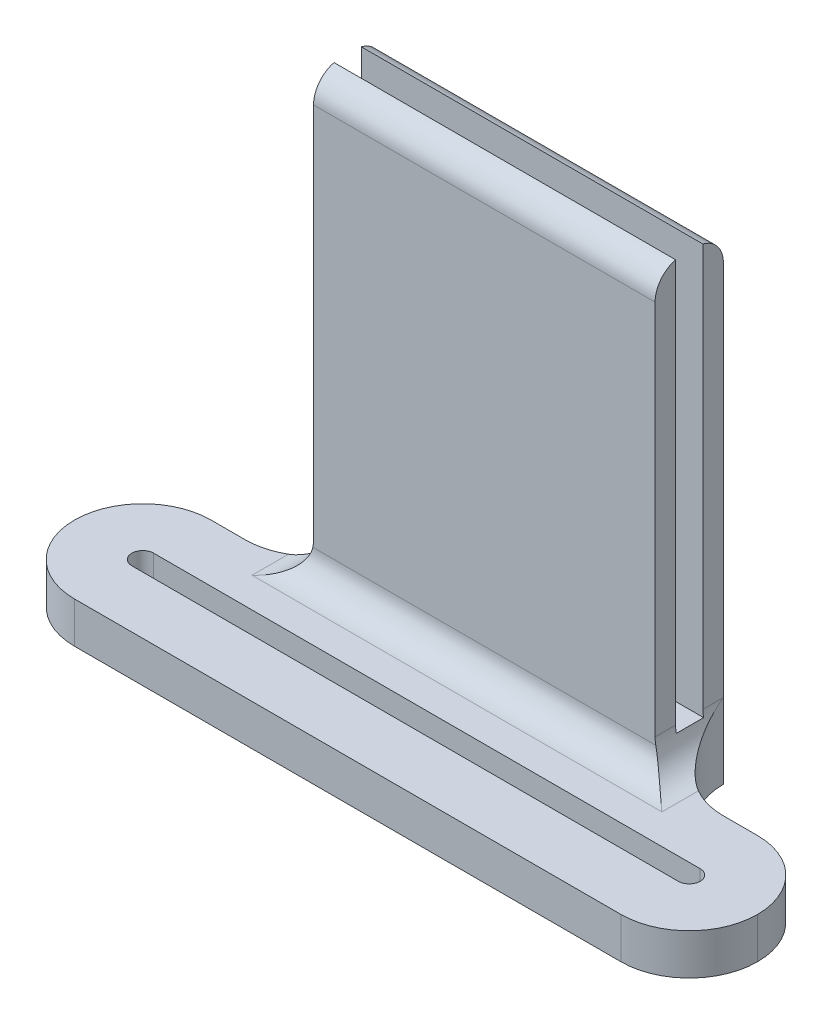
ISO-10303-21;
HEADER;
FILE_DESCRIPTION(('STEP AP214'),'2;1');
FILE_NAME('part.step','',(''),(''),'','','');
FILE_SCHEMA(('AUTOMOTIVE_DESIGN { 1 0 10303 214 1 1 1 1 }'));
ENDSEC;
DATA;
#1=APPLICATION_CONTEXT('core data for automotive mechanical design processes');
#2=APPLICATION_PROTOCOL_DEFINITION('international standard','automotive_design',2000,#1);
#3=PRODUCT_CONTEXT('',#1,'mechanical');
#4=PRODUCT('Part','Part','',(#3));
#5=PRODUCT_RELATED_PRODUCT_CATEGORY('part','',(#4));
#6=PRODUCT_DEFINITION_FORMATION('','',#4);
#7=PRODUCT_DEFINITION_CONTEXT('part definition',#1,'design');
#8=PRODUCT_DEFINITION('design','',#6,#7);
#9=PRODUCT_DEFINITION_SHAPE('','',#8);
#10=(LENGTH_UNIT() NAMED_UNIT(*) SI_UNIT(.MILLI.,.METRE.));
#11=(NAMED_UNIT(*) PLANE_ANGLE_UNIT() SI_UNIT($,.RADIAN.));
#12=(NAMED_UNIT(*) SI_UNIT($,.STERADIAN.) SOLID_ANGLE_UNIT());
#13=UNCERTAINTY_MEASURE_WITH_UNIT(LENGTH_MEASURE(1.E-05),#10,'distance_accuracy_value','');
#14=(GEOMETRIC_REPRESENTATION_CONTEXT(3) GLOBAL_UNCERTAINTY_ASSIGNED_CONTEXT((#13)) GLOBAL_UNIT_ASSIGNED_CONTEXT((#10,
#11,#12)) REPRESENTATION_CONTEXT('',''));
#15=CARTESIAN_POINT('',(0.,0.,0.));
#16=DIRECTION('',(0.,0.,1.));
#17=DIRECTION('',(1.,0.,0.));
#18=AXIS2_PLACEMENT_3D('',#15,#16,#17);
#19=CARTESIAN_POINT('',(25.,70.,5.));
#20=DIRECTION('',(-1.,0.,0.));
#21=DIRECTION('',(0.,0.,1.));
#22=AXIS2_PLACEMENT_3D('',#19,#20,#21);
#23=PLANE('',#22);
#24=DIRECTION('',(0.,1.,0.));
#25=VECTOR('',#24,1.);
#26=CARTESIAN_POINT('',(25.,10.,2.));
#27=LINE('',#26,#25);
#28=CARTESIAN_POINT('',(25.,11.,2.));
#29=VERTEX_POINT('',#28);
#30=CARTESIAN_POINT('',(25.,70.,2.));
#31=VERTEX_POINT('',#30);
#32=EDGE_CURVE('E287',#29,#31,#27,.T.);
#33=ORIENTED_EDGE('',*,*,#32,.T.);
#34=CARTESIAN_POINT('',(25.,66.1270166537926,0.999999999999999));
#35=DIRECTION('',(-1.,0.,0.));
#36=DIRECTION('',(0.,0.,1.));
#37=AXIS2_PLACEMENT_3D('',#34,#35,#36);
#38=CIRCLE('',#37,4.);
#39=CARTESIAN_POINT('',(25.,66.1270166537926,5.));
#40=VERTEX_POINT('',#39);
#41=EDGE_CURVE('E428',#31,#40,#38,.F.);
#42=ORIENTED_EDGE('',*,*,#41,.T.);
#43=DIRECTION('',(0.,-1.,0.));
#44=VECTOR('',#43,1.);
#45=CARTESIAN_POINT('',(25.,70.,5.));
#46=LINE('',#45,#44);
#47=CARTESIAN_POINT('',(25.,11.,5.));
#48=VERTEX_POINT('',#47);
#49=EDGE_CURVE('E301',#40,#48,#46,.T.);
#50=ORIENTED_EDGE('',*,*,#49,.T.);
#51=DIRECTION('',(0.,0.,-1.));
#52=VECTOR('',#51,1.);
#53=CARTESIAN_POINT('',(25.,11.,-5.));
#54=LINE('',#53,#52);
#55=EDGE_CURVE('E372',#48,#29,#54,.T.);
#56=ORIENTED_EDGE('',*,*,#55,.T.);
#57=EDGE_LOOP('',(#33,#42,#50,#56));
#58=FACE_BOUND('',#57,.T.);
#59=ADVANCED_FACE('F39',(#58),#23,.F.);
#60=CARTESIAN_POINT('',(-25.,70.,5.));
#61=DIRECTION('',(1.,0.,0.));
#62=DIRECTION('',(0.,0.,-1.));
#63=AXIS2_PLACEMENT_3D('',#60,#61,#62);
#64=PLANE('',#63);
#65=DIRECTION('',(0.,1.,0.));
#66=VECTOR('',#65,1.);
#67=CARTESIAN_POINT('',(-25.,10.,-2.));
#68=LINE('',#67,#66);
#69=CARTESIAN_POINT('',(-25.,11.,-2.));
#70=VERTEX_POINT('',#69);
#71=CARTESIAN_POINT('',(-25.,70.,-2.));
#72=VERTEX_POINT('',#71);
#73=EDGE_CURVE('E294',#70,#72,#68,.T.);
#74=ORIENTED_EDGE('',*,*,#73,.T.);
#75=CARTESIAN_POINT('',(-25.,66.1270166537926,-1.));
#76=DIRECTION('',(1.,0.,0.));
#77=DIRECTION('',(0.,0.,-1.));
#78=AXIS2_PLACEMENT_3D('',#75,#76,#77);
#79=CIRCLE('',#78,4.);
#80=CARTESIAN_POINT('',(-25.,66.1270166537926,-5.));
#81=VERTEX_POINT('',#80);
#82=EDGE_CURVE('E422',#72,#81,#79,.F.);
#83=ORIENTED_EDGE('',*,*,#82,.T.);
#84=DIRECTION('',(0.,-1.,0.));
#85=VECTOR('',#84,1.);
#86=CARTESIAN_POINT('',(-25.,70.,-5.));
#87=LINE('',#86,#85);
#88=CARTESIAN_POINT('',(-25.,11.,-5.));
#89=VERTEX_POINT('',#88);
#90=EDGE_CURVE('E307',#81,#89,#87,.T.);
#91=ORIENTED_EDGE('',*,*,#90,.T.);
#92=DIRECTION('',(0.,0.,1.));
#93=VECTOR('',#92,1.);
#94=CARTESIAN_POINT('',(-25.,11.,5.));
#95=LINE('',#94,#93);
#96=EDGE_CURVE('E362',#89,#70,#95,.T.);
#97=ORIENTED_EDGE('',*,*,#96,.T.);
#98=EDGE_LOOP('',(#74,#83,#91,#97));
#99=FACE_BOUND('',#98,.T.);
#100=ADVANCED_FACE('F466',(#99),#64,.F.);
#101=CARTESIAN_POINT('',(-25.,70.,5.));
#102=DIRECTION('',(0.,0.,-1.));
#103=DIRECTION('',(-1.,0.,0.));
#104=AXIS2_PLACEMENT_3D('',#101,#102,#103);
#105=PLANE('',#104);
#106=CARTESIAN_POINT('',(-30.,11.,5.));
#107=DIRECTION('',(0.,0.,-1.));
#108=DIRECTION('',(-1.,0.,0.));
#109=AXIS2_PLACEMENT_3D('',#106,#107,#108);
#110=CIRCLE('',#109,5.);
#111=CARTESIAN_POINT('',(-25.,11.,5.));
#112=VERTEX_POINT('',#111);
#113=CARTESIAN_POINT('',(-25.1010205144336,10.,5.));
#114=VERTEX_POINT('',#113);
#115=EDGE_CURVE('E383',#112,#114,#110,.T.);
#116=ORIENTED_EDGE('',*,*,#115,.T.);
#117=DIRECTION('',(-1.,0.,0.));
#118=VECTOR('',#117,1.);
#119=CARTESIAN_POINT('',(30.,10.,5.));
#120=LINE('',#119,#118);
#121=CARTESIAN_POINT('',(25.1010205144336,10.,5.));
#122=VERTEX_POINT('',#121);
#123=EDGE_CURVE('E60',#114,#122,#120,.F.);
#124=ORIENTED_EDGE('',*,*,#123,.T.);
#125=CARTESIAN_POINT('',(30.,11.,5.));
#126=DIRECTION('',(0.,0.,-1.));
#127=DIRECTION('',(-1.,0.,0.));
#128=AXIS2_PLACEMENT_3D('',#125,#126,#127);
#129=CIRCLE('',#128,5.);
#130=EDGE_CURVE('E430',#122,#48,#129,.T.);
#131=ORIENTED_EDGE('',*,*,#130,.T.);
#132=ORIENTED_EDGE('',*,*,#49,.F.);
#133=DIRECTION('',(-1.,0.,0.));
#134=VECTOR('',#133,1.);
#135=CARTESIAN_POINT('',(-25.,66.1270166537926,5.));
#136=LINE('',#135,#134);
#137=CARTESIAN_POINT('',(-25.,66.1270166537926,5.));
#138=VERTEX_POINT('',#137);
#139=EDGE_CURVE('E426',#40,#138,#136,.T.);
#140=ORIENTED_EDGE('',*,*,#139,.T.);
#141=DIRECTION('',(0.,-1.,0.));
#142=VECTOR('',#141,1.);
#143=CARTESIAN_POINT('',(-25.,70.,5.));
#144=LINE('',#143,#142);
#145=EDGE_CURVE('E304',#138,#112,#144,.T.);
#146=ORIENTED_EDGE('',*,*,#145,.T.);
#147=EDGE_LOOP('',(#116,#124,#131,#132,#140,#146));
#148=FACE_BOUND('',#147,.T.);
#149=ADVANCED_FACE('F494',(#148),#105,.F.);
#150=DIRECTION('',(0.,-1.,0.));
#151=VECTOR('',#150,1.);
#152=CARTESIAN_POINT('',(25.,70.,-5.));
#153=LINE('',#152,#151);
#154=CARTESIAN_POINT('',(25.,66.1270166537926,-5.));
#155=VERTEX_POINT('',#154);
#156=CARTESIAN_POINT('',(25.,11.,-5.));
#157=VERTEX_POINT('',#156);
#158=EDGE_CURVE('E310',#155,#157,#153,.T.);
#159=ORIENTED_EDGE('',*,*,#158,.F.);
#160=CARTESIAN_POINT('',(25.,66.1270166537926,-1.));
#161=DIRECTION('',(-1.,0.,0.));
#162=DIRECTION('',(0.,0.,1.));
#163=AXIS2_PLACEMENT_3D('',#160,#161,#162);
#164=CIRCLE('',#163,4.);
#165=CARTESIAN_POINT('',(25.,70.,-2.));
#166=VERTEX_POINT('',#165);
#167=EDGE_CURVE('E418',#155,#166,#164,.F.);
#168=ORIENTED_EDGE('',*,*,#167,.T.);
#169=DIRECTION('',(0.,1.,0.));
#170=VECTOR('',#169,1.);
#171=CARTESIAN_POINT('',(25.,10.,-2.));
#172=LINE('',#171,#170);
#173=CARTESIAN_POINT('',(25.,11.,-2.));
#174=VERTEX_POINT('',#173);
#175=EDGE_CURVE('E282',#174,#166,#172,.T.);
#176=ORIENTED_EDGE('',*,*,#175,.F.);
#177=DIRECTION('',(0.,0.,-1.));
#178=VECTOR('',#177,1.);
#179=CARTESIAN_POINT('',(25.,11.,-5.));
#180=LINE('',#179,#178);
#181=EDGE_CURVE('E369',#174,#157,#180,.T.);
#182=ORIENTED_EDGE('',*,*,#181,.T.);
#183=EDGE_LOOP('',(#159,#168,#176,#182));
#184=FACE_BOUND('',#183,.T.);
#185=ADVANCED_FACE('F458',(#184),#23,.F.);
#186=CARTESIAN_POINT('',(-25.,70.,-5.));
#187=DIRECTION('',(0.,0.,1.));
#188=DIRECTION('',(1.,0.,0.));
#189=AXIS2_PLACEMENT_3D('',#186,#187,#188);
#190=PLANE('',#189);
#191=ORIENTED_EDGE('',*,*,#90,.F.);
#192=DIRECTION('',(1.,0.,0.));
#193=VECTOR('',#192,1.);
#194=CARTESIAN_POINT('',(-25.,66.1270166537926,-5.));
#195=LINE('',#194,#193);
#196=EDGE_CURVE('E420',#81,#155,#195,.T.);
#197=ORIENTED_EDGE('',*,*,#196,.T.);
#198=ORIENTED_EDGE('',*,*,#158,.T.);
#199=CARTESIAN_POINT('',(25.,0.,-5.));
#200=VERTEX_POINT('',#199);
#201=EDGE_CURVE('E309',#157,#200,#153,.T.);
#202=ORIENTED_EDGE('',*,*,#201,.T.);
#203=DIRECTION('',(-1.,0.,0.));
#204=VECTOR('',#203,1.);
#205=CARTESIAN_POINT('',(-25.,0.,-5.));
#206=LINE('',#205,#204);
#207=CARTESIAN_POINT('',(-25.,0.,-5.));
#208=VERTEX_POINT('',#207);
#209=EDGE_CURVE('E290',#200,#208,#206,.T.);
#210=ORIENTED_EDGE('',*,*,#209,.T.);
#211=EDGE_CURVE('E306',#89,#208,#87,.T.);
#212=ORIENTED_EDGE('',*,*,#211,.F.);
#213=EDGE_LOOP('',(#191,#197,#198,#202,#210,#212));
#214=FACE_BOUND('',#213,.T.);
#215=ADVANCED_FACE('F500',(#214),#190,.F.);
#216=ORIENTED_EDGE('',*,*,#145,.F.);
#217=CARTESIAN_POINT('',(-25.,66.1270166537926,0.999999999999999));
#218=DIRECTION('',(1.,0.,0.));
#219=DIRECTION('',(0.,0.,-1.));
#220=AXIS2_PLACEMENT_3D('',#217,#218,#219);
#221=CIRCLE('',#220,4.);
#222=CARTESIAN_POINT('',(-25.,70.,2.));
#223=VERTEX_POINT('',#222);
#224=EDGE_CURVE('E424',#138,#223,#221,.F.);
#225=ORIENTED_EDGE('',*,*,#224,.T.);
#226=DIRECTION('',(0.,1.,0.));
#227=VECTOR('',#226,1.);
#228=CARTESIAN_POINT('',(-25.,10.,2.));
#229=LINE('',#228,#227);
#230=CARTESIAN_POINT('',(-25.,11.,2.));
#231=VERTEX_POINT('',#230);
#232=EDGE_CURVE('E291',#231,#223,#229,.T.);
#233=ORIENTED_EDGE('',*,*,#232,.F.);
#234=DIRECTION('',(0.,0.,1.));
#235=VECTOR('',#234,1.);
#236=CARTESIAN_POINT('',(-25.,11.,5.));
#237=LINE('',#236,#235);
#238=EDGE_CURVE('E359',#231,#112,#237,.T.);
#239=ORIENTED_EDGE('',*,*,#238,.T.);
#240=EDGE_LOOP('',(#216,#225,#233,#239));
#241=FACE_BOUND('',#240,.T.);
#242=ADVANCED_FACE('F496',(#241),#64,.F.);
#243=CARTESIAN_POINT('',(0.,0.,0.));
#244=DIRECTION('',(0.,-1.,0.));
#245=DIRECTION('',(0.,0.,-1.));
#246=AXIS2_PLACEMENT_3D('',#243,#244,#245);
#247=PLANE('',#246);
#248=CARTESIAN_POINT('',(-40.,0.,15.));
#249=DIRECTION('',(0.,1.,0.));
#250=DIRECTION('',(0.,0.,1.));
#251=AXIS2_PLACEMENT_3D('',#248,#249,#250);
#252=CIRCLE('',#251,1.6);
#253=CARTESIAN_POINT('',(-40.,0.,13.4));
#254=VERTEX_POINT('',#253);
#255=CARTESIAN_POINT('',(-40.,0.,16.6));
#256=VERTEX_POINT('',#255);
#257=EDGE_CURVE('E222',#254,#256,#252,.T.);
#258=ORIENTED_EDGE('',*,*,#257,.T.);
#259=DIRECTION('',(1.,0.,0.));
#260=VECTOR('',#259,1.);
#261=CARTESIAN_POINT('',(-40.,0.,16.6));
#262=LINE('',#261,#260);
#263=CARTESIAN_POINT('',(40.,0.,16.6));
#264=VERTEX_POINT('',#263);
#265=EDGE_CURVE('E234',#256,#264,#262,.T.);
#266=ORIENTED_EDGE('',*,*,#265,.T.);
#267=CARTESIAN_POINT('',(40.,0.,15.));
#268=DIRECTION('',(0.,1.,0.));
#269=DIRECTION('',(0.,0.,1.));
#270=AXIS2_PLACEMENT_3D('',#267,#268,#269);
#271=CIRCLE('',#270,1.6);
#272=CARTESIAN_POINT('',(40.,0.,13.4));
#273=VERTEX_POINT('',#272);
#274=EDGE_CURVE('E238',#264,#273,#271,.T.);
#275=ORIENTED_EDGE('',*,*,#274,.T.);
#276=DIRECTION('',(-1.,0.,0.));
#277=VECTOR('',#276,1.);
#278=CARTESIAN_POINT('',(-40.,0.,13.4));
#279=LINE('',#278,#277);
#280=EDGE_CURVE('E230',#273,#254,#279,.T.);
#281=ORIENTED_EDGE('',*,*,#280,.T.);
#282=EDGE_LOOP('',(#258,#266,#275,#281));
#283=FACE_BOUND('',#282,.T.);
#284=DIRECTION('',(1.,0.,0.));
#285=VECTOR('',#284,1.);
#286=CARTESIAN_POINT('',(-50.,0.,25.));
#287=LINE('',#286,#285);
#288=CARTESIAN_POINT('',(-40.,0.,25.));
#289=VERTEX_POINT('',#288);
#290=CARTESIAN_POINT('',(40.,0.,25.));
#291=VERTEX_POINT('',#290);
#292=EDGE_CURVE('E262',#289,#291,#287,.T.);
#293=ORIENTED_EDGE('',*,*,#292,.F.);
#294=CARTESIAN_POINT('',(-40.,0.,15.));
#295=DIRECTION('',(0.,-1.,0.));
#296=DIRECTION('',(0.,0.,-1.));
#297=AXIS2_PLACEMENT_3D('',#294,#295,#296);
#298=CIRCLE('',#297,10.);
#299=CARTESIAN_POINT('',(-50.,0.,15.));
#300=VERTEX_POINT('',#299);
#301=EDGE_CURVE('E332',#289,#300,#298,.T.);
#302=ORIENTED_EDGE('',*,*,#301,.T.);
#303=CARTESIAN_POINT('',(-40.,0.,15.));
#304=DIRECTION('',(0.,-1.,0.));
#305=DIRECTION('',(0.,0.,-1.));
#306=AXIS2_PLACEMENT_3D('',#303,#304,#305);
#307=CIRCLE('',#306,10.);
#308=CARTESIAN_POINT('',(-40.,0.,5.));
#309=VERTEX_POINT('',#308);
#310=EDGE_CURVE('E330',#300,#309,#307,.T.);
#311=ORIENTED_EDGE('',*,*,#310,.T.);
#312=DIRECTION('',(1.,0.,0.));
#313=VECTOR('',#312,1.);
#314=CARTESIAN_POINT('',(-50.,0.,5.));
#315=LINE('',#314,#313);
#316=CARTESIAN_POINT('',(-35.,0.,5.));
#317=VERTEX_POINT('',#316);
#318=EDGE_CURVE('E270',#309,#317,#315,.T.);
#319=ORIENTED_EDGE('',*,*,#318,.T.);
#320=CARTESIAN_POINT('',(-35.,0.,-5.));
#321=DIRECTION('',(0.,-1.,0.));
#322=DIRECTION('',(0.,0.,-1.));
#323=AXIS2_PLACEMENT_3D('',#320,#321,#322);
#324=CIRCLE('',#323,10.);
#325=EDGE_CURVE('E350',#317,#208,#324,.F.);
#326=ORIENTED_EDGE('',*,*,#325,.T.);
#327=ORIENTED_EDGE('',*,*,#209,.F.);
#328=CARTESIAN_POINT('',(35.,0.,-5.));
#329=DIRECTION('',(0.,-1.,0.));
#330=DIRECTION('',(0.,0.,-1.));
#331=AXIS2_PLACEMENT_3D('',#328,#329,#330);
#332=CIRCLE('',#331,10.);
#333=CARTESIAN_POINT('',(35.,0.,5.));
#334=VERTEX_POINT('',#333);
#335=EDGE_CURVE('E354',#200,#334,#332,.F.);
#336=ORIENTED_EDGE('',*,*,#335,.T.);
#337=CARTESIAN_POINT('',(40.,0.,5.));
#338=VERTEX_POINT('',#337);
#339=EDGE_CURVE('E274',#334,#338,#315,.T.);
#340=ORIENTED_EDGE('',*,*,#339,.T.);
#341=CARTESIAN_POINT('',(40.,0.,15.));
#342=DIRECTION('',(0.,-1.,0.));
#343=DIRECTION('',(0.,0.,-1.));
#344=AXIS2_PLACEMENT_3D('',#341,#342,#343);
#345=CIRCLE('',#344,10.);
#346=CARTESIAN_POINT('',(50.,0.,15.));
#347=VERTEX_POINT('',#346);
#348=EDGE_CURVE('E326',#338,#347,#345,.T.);
#349=ORIENTED_EDGE('',*,*,#348,.T.);
#350=CARTESIAN_POINT('',(40.,0.,15.));
#351=DIRECTION('',(0.,-1.,0.));
#352=DIRECTION('',(0.,0.,-1.));
#353=AXIS2_PLACEMENT_3D('',#350,#351,#352);
#354=CIRCLE('',#353,10.);
#355=EDGE_CURVE('E328',#347,#291,#354,.T.);
#356=ORIENTED_EDGE('',*,*,#355,.T.);
#357=EDGE_LOOP('',(#293,#302,#311,#319,#326,#327,#336,#340,#349,#356));
#358=FACE_BOUND('',#357,.T.);
#359=ADVANCED_FACE('F240',(#283,#358),#247,.T.);
#360=CARTESIAN_POINT('',(-25.,10.,2.));
#361=DIRECTION('',(0.,0.,1.));
#362=DIRECTION('',(1.,0.,0.));
#363=AXIS2_PLACEMENT_3D('',#360,#361,#362);
#364=PLANE('',#363);
#365=DIRECTION('',(1.,0.,0.));
#366=VECTOR('',#365,1.);
#367=CARTESIAN_POINT('',(-25.,70.,2.));
#368=LINE('',#367,#366);
#369=EDGE_CURVE('E280',#223,#31,#368,.T.);
#370=ORIENTED_EDGE('',*,*,#369,.T.);
#371=ORIENTED_EDGE('',*,*,#32,.F.);
#372=CARTESIAN_POINT('',(30.,11.,2.));
#373=DIRECTION('',(0.,0.,1.));
#374=DIRECTION('',(1.,0.,0.));
#375=AXIS2_PLACEMENT_3D('',#372,#373,#374);
#376=CIRCLE('',#375,5.);
#377=CARTESIAN_POINT('',(25.1010205144336,10.,2.));
#378=VERTEX_POINT('',#377);
#379=EDGE_CURVE('E394',#29,#378,#376,.T.);
#380=ORIENTED_EDGE('',*,*,#379,.T.);
#381=DIRECTION('',(1.,0.,0.));
#382=VECTOR('',#381,1.);
#383=CARTESIAN_POINT('',(-25.,10.,2.));
#384=LINE('',#383,#382);
#385=CARTESIAN_POINT('',(-25.1010205144336,10.,2.));
#386=VERTEX_POINT('',#385);
#387=EDGE_CURVE('E279',#386,#378,#384,.T.);
#388=ORIENTED_EDGE('',*,*,#387,.F.);
#389=CARTESIAN_POINT('',(-30.,11.,2.));
#390=DIRECTION('',(0.,0.,1.));
#391=DIRECTION('',(1.,0.,0.));
#392=AXIS2_PLACEMENT_3D('',#389,#390,#391);
#393=CIRCLE('',#392,5.);
#394=EDGE_CURVE('E381',#386,#231,#393,.T.);
#395=ORIENTED_EDGE('',*,*,#394,.T.);
#396=ORIENTED_EDGE('',*,*,#232,.T.);
#397=EDGE_LOOP('',(#370,#371,#380,#388,#395,#396));
#398=FACE_BOUND('',#397,.T.);
#399=ADVANCED_FACE('F447',(#398),#364,.F.);
#400=CARTESIAN_POINT('',(-25.,10.,-2.));
#401=DIRECTION('',(0.,0.,-1.));
#402=DIRECTION('',(-1.,0.,0.));
#403=AXIS2_PLACEMENT_3D('',#400,#401,#402);
#404=PLANE('',#403);
#405=DIRECTION('',(-1.,0.,0.));
#406=VECTOR('',#405,1.);
#407=CARTESIAN_POINT('',(-25.,70.,-2.));
#408=LINE('',#407,#406);
#409=EDGE_CURVE('E269',#166,#72,#408,.T.);
#410=ORIENTED_EDGE('',*,*,#409,.T.);
#411=ORIENTED_EDGE('',*,*,#73,.F.);
#412=CARTESIAN_POINT('',(-30.,11.,-2.));
#413=DIRECTION('',(0.,0.,-1.));
#414=DIRECTION('',(-1.,0.,0.));
#415=AXIS2_PLACEMENT_3D('',#412,#413,#414);
#416=CIRCLE('',#415,5.);
#417=CARTESIAN_POINT('',(-25.1010205144336,10.,-2.));
#418=VERTEX_POINT('',#417);
#419=EDGE_CURVE('E375',#70,#418,#416,.T.);
#420=ORIENTED_EDGE('',*,*,#419,.T.);
#421=DIRECTION('',(-1.,0.,0.));
#422=VECTOR('',#421,1.);
#423=CARTESIAN_POINT('',(-25.,10.,-2.));
#424=LINE('',#423,#422);
#425=CARTESIAN_POINT('',(25.1010205144336,10.,-2.));
#426=VERTEX_POINT('',#425);
#427=EDGE_CURVE('E277',#426,#418,#424,.T.);
#428=ORIENTED_EDGE('',*,*,#427,.F.);
#429=CARTESIAN_POINT('',(30.,11.,-2.));
#430=DIRECTION('',(0.,0.,-1.));
#431=DIRECTION('',(-1.,0.,0.));
#432=AXIS2_PLACEMENT_3D('',#429,#430,#431);
#433=CIRCLE('',#432,5.);
#434=EDGE_CURVE('E438',#426,#174,#433,.T.);
#435=ORIENTED_EDGE('',*,*,#434,.T.);
#436=ORIENTED_EDGE('',*,*,#175,.T.);
#437=EDGE_LOOP('',(#410,#411,#420,#428,#435,#436));
#438=FACE_BOUND('',#437,.T.);
#439=ADVANCED_FACE('F454',(#438),#404,.F.);
#440=CARTESIAN_POINT('',(0.,10.,0.));
#441=DIRECTION('',(0.,-1.,0.));
#442=DIRECTION('',(0.,0.,-1.));
#443=AXIS2_PLACEMENT_3D('',#440,#441,#442);
#444=PLANE('',#443);
#445=ORIENTED_EDGE('',*,*,#387,.T.);
#446=DIRECTION('',(0.,0.,1.));
#447=VECTOR('',#446,1.);
#448=CARTESIAN_POINT('',(25.1010205144336,10.,2.));
#449=LINE('',#448,#447);
#450=EDGE_CURVE('E439',#378,#426,#449,.F.);
#451=ORIENTED_EDGE('',*,*,#450,.T.);
#452=ORIENTED_EDGE('',*,*,#427,.T.);
#453=DIRECTION('',(0.,0.,-1.));
#454=VECTOR('',#453,1.);
#455=CARTESIAN_POINT('',(-25.1010205144336,10.,-2.));
#456=LINE('',#455,#454);
#457=EDGE_CURVE('E378',#418,#386,#456,.F.);
#458=ORIENTED_EDGE('',*,*,#457,.T.);
#459=EDGE_LOOP('',(#445,#451,#452,#458));
#460=FACE_BOUND('',#459,.T.);
#461=ADVANCED_FACE('F473',(#460),#444,.F.);
#462=CARTESIAN_POINT('',(0.,0.,5.));
#463=DIRECTION('',(0.,0.,-1.));
#464=DIRECTION('',(-1.,0.,0.));
#465=AXIS2_PLACEMENT_3D('',#462,#463,#464);
#466=PLANE('',#465);
#467=ORIENTED_EDGE('',*,*,#339,.F.);
#468=DIRECTION('',(0.,-1.,0.));
#469=VECTOR('',#468,1.);
#470=CARTESIAN_POINT('',(35.,0.,5.));
#471=LINE('',#470,#469);
#472=CARTESIAN_POINT('',(35.,6.,5.));
#473=VERTEX_POINT('',#472);
#474=EDGE_CURVE('E348',#334,#473,#471,.F.);
#475=ORIENTED_EDGE('',*,*,#474,.T.);
#476=DIRECTION('',(-1.,0.,0.));
#477=VECTOR('',#476,1.);
#478=CARTESIAN_POINT('',(-50.,6.,5.));
#479=LINE('',#478,#477);
#480=CARTESIAN_POINT('',(40.,6.,5.));
#481=VERTEX_POINT('',#480);
#482=EDGE_CURVE('E266',#481,#473,#479,.T.);
#483=ORIENTED_EDGE('',*,*,#482,.F.);
#484=DIRECTION('',(0.,1.,0.));
#485=VECTOR('',#484,1.);
#486=CARTESIAN_POINT('',(40.,0.,5.));
#487=LINE('',#486,#485);
#488=EDGE_CURVE('E337',#481,#338,#487,.F.);
#489=ORIENTED_EDGE('',*,*,#488,.T.);
#490=EDGE_LOOP('',(#467,#475,#483,#489));
#491=FACE_BOUND('',#490,.T.);
#492=ADVANCED_FACE('F475',(#491),#466,.T.);
#493=CARTESIAN_POINT('',(-50.,6.,25.));
#494=DIRECTION('',(0.,-1.,0.));
#495=DIRECTION('',(0.,0.,-1.));
#496=AXIS2_PLACEMENT_3D('',#493,#494,#495);
#497=PLANE('',#496);
#498=DIRECTION('',(1.,0.,0.));
#499=VECTOR('',#498,1.);
#500=CARTESIAN_POINT('',(-40.,6.,16.6));
#501=LINE('',#500,#499);
#502=CARTESIAN_POINT('',(-40.,6.,16.6));
#503=VERTEX_POINT('',#502);
#504=CARTESIAN_POINT('',(40.,6.,16.6));
#505=VERTEX_POINT('',#504);
#506=EDGE_CURVE('E252',#503,#505,#501,.T.);
#507=ORIENTED_EDGE('',*,*,#506,.F.);
#508=CARTESIAN_POINT('',(-40.,6.,15.));
#509=DIRECTION('',(0.,1.,0.));
#510=DIRECTION('',(0.,0.,1.));
#511=AXIS2_PLACEMENT_3D('',#508,#509,#510);
#512=CIRCLE('',#511,1.6);
#513=CARTESIAN_POINT('',(-40.,6.,13.4));
#514=VERTEX_POINT('',#513);
#515=EDGE_CURVE('E225',#514,#503,#512,.T.);
#516=ORIENTED_EDGE('',*,*,#515,.F.);
#517=DIRECTION('',(-1.,0.,0.));
#518=VECTOR('',#517,1.);
#519=CARTESIAN_POINT('',(-40.,6.,13.4));
#520=LINE('',#519,#518);
#521=CARTESIAN_POINT('',(40.,6.,13.4));
#522=VERTEX_POINT('',#521);
#523=EDGE_CURVE('E243',#522,#514,#520,.T.);
#524=ORIENTED_EDGE('',*,*,#523,.F.);
#525=CARTESIAN_POINT('',(40.,6.,15.));
#526=DIRECTION('',(0.,1.,0.));
#527=DIRECTION('',(0.,0.,1.));
#528=AXIS2_PLACEMENT_3D('',#525,#526,#527);
#529=CIRCLE('',#528,1.6);
#530=EDGE_CURVE('E246',#505,#522,#529,.T.);
#531=ORIENTED_EDGE('',*,*,#530,.F.);
#532=EDGE_LOOP('',(#507,#516,#524,#531));
#533=FACE_BOUND('',#532,.T.);
#534=DIRECTION('',(-1.,0.,0.));
#535=VECTOR('',#534,1.);
#536=CARTESIAN_POINT('',(-30.,6.,9.));
#537=LINE('',#536,#535);
#538=CARTESIAN_POINT('',(30.,6.,9.));
#539=VERTEX_POINT('',#538);
#540=CARTESIAN_POINT('',(-30.,6.,9.));
#541=VERTEX_POINT('',#540);
#542=EDGE_CURVE('E415',#539,#541,#537,.T.);
#543=ORIENTED_EDGE('',*,*,#542,.T.);
#544=DIRECTION('',(0.,0.,1.));
#545=VECTOR('',#544,1.);
#546=CARTESIAN_POINT('',(-30.,6.,-5.));
#547=LINE('',#546,#545);
#548=CARTESIAN_POINT('',(-30.,6.,3.66025403784439));
#549=VERTEX_POINT('',#548);
#550=EDGE_CURVE('E367',#541,#549,#547,.F.);
#551=ORIENTED_EDGE('',*,*,#550,.T.);
#552=CARTESIAN_POINT('',(-35.,6.,-5.));
#553=DIRECTION('',(0.,-1.,0.));
#554=DIRECTION('',(0.,0.,-1.));
#555=AXIS2_PLACEMENT_3D('',#552,#553,#554);
#556=CIRCLE('',#555,10.);
#557=CARTESIAN_POINT('',(-35.,6.,5.));
#558=VERTEX_POINT('',#557);
#559=EDGE_CURVE('E352',#549,#558,#556,.T.);
#560=ORIENTED_EDGE('',*,*,#559,.T.);
#561=CARTESIAN_POINT('',(-40.,6.,5.));
#562=VERTEX_POINT('',#561);
#563=EDGE_CURVE('E273',#558,#562,#479,.T.);
#564=ORIENTED_EDGE('',*,*,#563,.T.);
#565=CARTESIAN_POINT('',(-40.,6.,15.));
#566=DIRECTION('',(0.,-1.,0.));
#567=DIRECTION('',(0.,0.,-1.));
#568=AXIS2_PLACEMENT_3D('',#565,#566,#567);
#569=CIRCLE('',#568,10.);
#570=CARTESIAN_POINT('',(-50.,6.,15.));
#571=VERTEX_POINT('',#570);
#572=EDGE_CURVE('E322',#562,#571,#569,.F.);
#573=ORIENTED_EDGE('',*,*,#572,.T.);
#574=CARTESIAN_POINT('',(-40.,6.,15.));
#575=DIRECTION('',(0.,-1.,0.));
#576=DIRECTION('',(0.,0.,-1.));
#577=AXIS2_PLACEMENT_3D('',#574,#575,#576);
#578=CIRCLE('',#577,10.);
#579=CARTESIAN_POINT('',(-40.,6.,25.));
#580=VERTEX_POINT('',#579);
#581=EDGE_CURVE('E324',#571,#580,#578,.F.);
#582=ORIENTED_EDGE('',*,*,#581,.T.);
#583=DIRECTION('',(-1.,0.,0.));
#584=VECTOR('',#583,1.);
#585=CARTESIAN_POINT('',(-50.,6.,25.));
#586=LINE('',#585,#584);
#587=CARTESIAN_POINT('',(40.,6.,25.));
#588=VERTEX_POINT('',#587);
#589=EDGE_CURVE('E265',#588,#580,#586,.T.);
#590=ORIENTED_EDGE('',*,*,#589,.F.);
#591=CARTESIAN_POINT('',(40.,6.,15.));
#592=DIRECTION('',(0.,-1.,0.));
#593=DIRECTION('',(0.,0.,-1.));
#594=AXIS2_PLACEMENT_3D('',#591,#592,#593);
#595=CIRCLE('',#594,10.);
#596=CARTESIAN_POINT('',(50.,6.,15.));
#597=VERTEX_POINT('',#596);
#598=EDGE_CURVE('E320',#588,#597,#595,.F.);
#599=ORIENTED_EDGE('',*,*,#598,.T.);
#600=CARTESIAN_POINT('',(40.,6.,15.));
#601=DIRECTION('',(0.,-1.,0.));
#602=DIRECTION('',(0.,0.,-1.));
#603=AXIS2_PLACEMENT_3D('',#600,#601,#602);
#604=CIRCLE('',#603,10.);
#605=EDGE_CURVE('E318',#597,#481,#604,.F.);
#606=ORIENTED_EDGE('',*,*,#605,.T.);
#607=ORIENTED_EDGE('',*,*,#482,.T.);
#608=CARTESIAN_POINT('',(35.,6.00000000000001,-5.));
#609=DIRECTION('',(0.,-1.,0.));
#610=DIRECTION('',(0.,0.,-1.));
#611=AXIS2_PLACEMENT_3D('',#608,#609,#610);
#612=CIRCLE('',#611,10.);
#613=CARTESIAN_POINT('',(30.,6.00000000000001,3.66025403784439));
#614=VERTEX_POINT('',#613);
#615=EDGE_CURVE('E356',#473,#614,#612,.T.);
#616=ORIENTED_EDGE('',*,*,#615,.T.);
#617=DIRECTION('',(0.,0.,-1.));
#618=VECTOR('',#617,1.);
#619=CARTESIAN_POINT('',(30.,6.,5.));
#620=LINE('',#619,#618);
#621=EDGE_CURVE('E365',#614,#539,#620,.F.);
#622=ORIENTED_EDGE('',*,*,#621,.T.);
#623=EDGE_LOOP('',(#543,#551,#560,#564,#573,#582,#590,#599,#606,#607,#616,#622));
#624=FACE_BOUND('',#623,.T.);
#625=ADVANCED_FACE('F481',(#533,#624),#497,.F.);
#626=CARTESIAN_POINT('',(0.,0.,25.));
#627=DIRECTION('',(0.,0.,-1.));
#628=DIRECTION('',(-1.,0.,0.));
#629=AXIS2_PLACEMENT_3D('',#626,#627,#628);
#630=PLANE('',#629);
#631=ORIENTED_EDGE('',*,*,#292,.T.);
#632=DIRECTION('',(0.,1.,0.));
#633=VECTOR('',#632,1.);
#634=CARTESIAN_POINT('',(40.,0.,25.));
#635=LINE('',#634,#633);
#636=EDGE_CURVE('E315',#291,#588,#635,.T.);
#637=ORIENTED_EDGE('',*,*,#636,.T.);
#638=ORIENTED_EDGE('',*,*,#589,.T.);
#639=DIRECTION('',(0.,-1.,0.));
#640=VECTOR('',#639,1.);
#641=CARTESIAN_POINT('',(-40.,0.,25.));
#642=LINE('',#641,#640);
#643=EDGE_CURVE('E312',#580,#289,#642,.T.);
#644=ORIENTED_EDGE('',*,*,#643,.T.);
#645=EDGE_LOOP('',(#631,#637,#638,#644));
#646=FACE_BOUND('',#645,.T.);
#647=ADVANCED_FACE('F556',(#646),#630,.F.);
#648=ORIENTED_EDGE('',*,*,#563,.F.);
#649=DIRECTION('',(0.,-1.,0.));
#650=VECTOR('',#649,1.);
#651=CARTESIAN_POINT('',(-35.,0.,5.));
#652=LINE('',#651,#650);
#653=EDGE_CURVE('E340',#558,#317,#652,.T.);
#654=ORIENTED_EDGE('',*,*,#653,.T.);
#655=ORIENTED_EDGE('',*,*,#318,.F.);
#656=DIRECTION('',(0.,-1.,0.));
#657=VECTOR('',#656,1.);
#658=CARTESIAN_POINT('',(-40.,6.,5.));
#659=LINE('',#658,#657);
#660=EDGE_CURVE('E334',#309,#562,#659,.F.);
#661=ORIENTED_EDGE('',*,*,#660,.T.);
#662=EDGE_LOOP('',(#648,#654,#655,#661));
#663=FACE_BOUND('',#662,.T.);
#664=ADVANCED_FACE('F484',(#663),#466,.T.);
#665=CARTESIAN_POINT('',(40.,0.,15.));
#666=DIRECTION('',(0.,-1.,0.));
#667=DIRECTION('',(0.,0.,-1.));
#668=AXIS2_PLACEMENT_3D('',#665,#666,#667);
#669=CYLINDRICAL_SURFACE('',#668,10.);
#670=DIRECTION('',(0.,1.,0.));
#671=VECTOR('',#670,1.);
#672=CARTESIAN_POINT('',(50.,6.,15.));
#673=LINE('',#672,#671);
#674=EDGE_CURVE('E341',#347,#597,#673,.T.);
#675=ORIENTED_EDGE('',*,*,#674,.F.);
#676=ORIENTED_EDGE('',*,*,#348,.F.);
#677=ORIENTED_EDGE('',*,*,#488,.F.);
#678=ORIENTED_EDGE('',*,*,#605,.F.);
#679=EDGE_LOOP('',(#675,#676,#677,#678));
#680=FACE_BOUND('',#679,.T.);
#681=ADVANCED_FACE('F566',(#680),#669,.T.);
#682=CARTESIAN_POINT('',(40.,0.,15.));
#683=DIRECTION('',(0.,1.,0.));
#684=DIRECTION('',(0.,0.,1.));
#685=AXIS2_PLACEMENT_3D('',#682,#683,#684);
#686=CYLINDRICAL_SURFACE('',#685,10.);
#687=ORIENTED_EDGE('',*,*,#355,.F.);
#688=ORIENTED_EDGE('',*,*,#674,.T.);
#689=ORIENTED_EDGE('',*,*,#598,.F.);
#690=ORIENTED_EDGE('',*,*,#636,.F.);
#691=EDGE_LOOP('',(#687,#688,#689,#690));
#692=FACE_BOUND('',#691,.T.);
#693=ADVANCED_FACE('F562',(#692),#686,.T.);
#694=CARTESIAN_POINT('',(-40.,0.,15.));
#695=DIRECTION('',(0.,1.,0.));
#696=DIRECTION('',(0.,0.,1.));
#697=AXIS2_PLACEMENT_3D('',#694,#695,#696);
#698=CYLINDRICAL_SURFACE('',#697,10.);
#699=DIRECTION('',(0.,-1.,0.));
#700=VECTOR('',#699,1.);
#701=CARTESIAN_POINT('',(-50.,0.,15.));
#702=LINE('',#701,#700);
#703=EDGE_CURVE('E258',#571,#300,#702,.T.);
#704=ORIENTED_EDGE('',*,*,#703,.F.);
#705=ORIENTED_EDGE('',*,*,#572,.F.);
#706=ORIENTED_EDGE('',*,*,#660,.F.);
#707=ORIENTED_EDGE('',*,*,#310,.F.);
#708=EDGE_LOOP('',(#704,#705,#706,#707));
#709=FACE_BOUND('',#708,.T.);
#710=ADVANCED_FACE('F551',(#709),#698,.T.);
#711=CARTESIAN_POINT('',(-40.,0.,15.));
#712=DIRECTION('',(0.,-1.,0.));
#713=DIRECTION('',(0.,0.,-1.));
#714=AXIS2_PLACEMENT_3D('',#711,#712,#713);
#715=CYLINDRICAL_SURFACE('',#714,10.);
#716=ORIENTED_EDGE('',*,*,#581,.F.);
#717=ORIENTED_EDGE('',*,*,#703,.T.);
#718=ORIENTED_EDGE('',*,*,#301,.F.);
#719=ORIENTED_EDGE('',*,*,#643,.F.);
#720=EDGE_LOOP('',(#716,#717,#718,#719));
#721=FACE_BOUND('',#720,.T.);
#722=ADVANCED_FACE('F554',(#721),#715,.T.);
#723=CARTESIAN_POINT('',(-35.,0.,-5.));
#724=DIRECTION('',(0.,-1.,0.));
#725=DIRECTION('',(0.,0.,-1.));
#726=AXIS2_PLACEMENT_3D('',#723,#724,#725);
#727=CYLINDRICAL_SURFACE('',#726,10.);
#728=ORIENTED_EDGE('',*,*,#559,.F.);
#729=CARTESIAN_POINT('',(-30.,6.,3.66025403784439));
#730=CARTESIAN_POINT('',(-29.9063901960152,6.00000028290077,3.6062120074578));
#731=CARTESIAN_POINT('',(-29.8136887355509,6.00262887455136,3.55066295495205));
#732=CARTESIAN_POINT('',(-29.6303586139701,6.012837252933,3.43674013232139));
#733=CARTESIAN_POINT('',(-29.5397292388373,6.02041530668883,3.37836735749915));
#734=CARTESIAN_POINT('',(-29.2717275596113,6.05006435501231,3.19956698087094));
#735=CARTESIAN_POINT('',(-29.0977250390683,6.07905365213284,3.07515854387195));
#736=CARTESIAN_POINT('',(-28.7624925016688,6.15256185767134,2.81904443475575));
#737=CARTESIAN_POINT('',(-28.6011238336321,6.19686998153989,2.68745724550813));
#738=CARTESIAN_POINT('',(-28.2891932012269,6.29892716458515,2.41672140086481));
#739=CARTESIAN_POINT('',(-28.1386392947014,6.35668611250903,2.27756724037253));
#740=CARTESIAN_POINT('',(-27.8212230033609,6.4957352209033,1.96588828465629));
#741=CARTESIAN_POINT('',(-27.6567013063151,6.57941137953574,1.79204858687787));
#742=CARTESIAN_POINT('',(-27.3436812510737,6.76011372423578,1.43714173518511));
#743=CARTESIAN_POINT('',(-27.1951832358636,6.85714019596471,1.25607442667792));
#744=CARTESIAN_POINT('',(-26.9131540087972,7.06274155527057,0.887032941535188));
#745=CARTESIAN_POINT('',(-26.7797114564667,7.17137818980305,0.699025709426985));
#746=CARTESIAN_POINT('',(-26.5283293342775,7.39776170220442,0.318165301310166));
#747=CARTESIAN_POINT('',(-26.4103943084497,7.51551123435892,0.125310724558577));
#748=CARTESIAN_POINT('',(-26.1448413677447,7.80766922049535,-0.343264061817116));
#749=CARTESIAN_POINT('',(-26.0045589604871,7.9857031510398,-0.620897636726001));
#750=CARTESIAN_POINT('',(-25.752485139773,8.35270007359216,-1.18187355818818));
#751=CARTESIAN_POINT('',(-25.6407065130599,8.54166792406383,-1.46521840552305));
#752=CARTESIAN_POINT('',(-25.4447587075372,8.92720972137606,-2.03552207440248));
#753=CARTESIAN_POINT('',(-25.3605481977862,9.12377178346146,-2.32247480990702));
#754=CARTESIAN_POINT('',(-25.2186939466712,9.52222740575506,-2.89901450822322));
#755=CARTESIAN_POINT('',(-25.1610387667105,9.72411863075127,-3.1886002819473));
#756=CARTESIAN_POINT('',(-25.0778620545014,10.1029157974057,-3.72909183787995));
#757=CARTESIAN_POINT('',(-25.0489914504686,10.2794008009863,-3.97978824870875));
#758=CARTESIAN_POINT('',(-25.0102820427947,10.6334209377075,-4.48156738398778));
#759=CARTESIAN_POINT('',(-25.0004231842985,10.8109547658963,-4.73264942143853));
#760=CARTESIAN_POINT('',(-25.0000044457948,10.9923020170791,-4.98911340789317));
#761=CARTESIAN_POINT('',(-25.0000000014709,10.9961510202373,-4.9945567203506));
#762=CARTESIAN_POINT('',(-25.,11.,-5.));
#763=B_SPLINE_CURVE_WITH_KNOTS('',3,(#729,#730,#731,#732,#733,#734,#735,#736,#737,#738,#739,
#740,#741,#742,#743,#744,#745,#746,#747,#748,#749,#750,#751,#752,#753,#754,#755,#756,#757,#758,
#759,#760,#761,#762),.UNSPECIFIED.,.F.,.F.,(4,2,2,2,2,2,2,2,2,2,2,2,2,2,2,2,4),(0.,
0.324164501699153,0.648215563169975,1.29453690515217,1.93229735394221,2.57052815854178,
3.33008992767271,4.0896679519408,4.85350822338372,5.6175718196543,6.69122947966725,
7.76536793656894,8.83788855857111,9.90994676377595,10.8332249647611,11.7555286965104,
11.7755287009549),.UNSPECIFIED.);
#764=EDGE_CURVE('E385',#549,#89,#763,.T.);
#765=ORIENTED_EDGE('',*,*,#764,.T.);
#766=ORIENTED_EDGE('',*,*,#211,.T.);
#767=ORIENTED_EDGE('',*,*,#325,.F.);
#768=ORIENTED_EDGE('',*,*,#653,.F.);
#769=EDGE_LOOP('',(#728,#765,#766,#767,#768));
#770=FACE_BOUND('',#769,.T.);
#771=ADVANCED_FACE('F396',(#770),#727,.F.);
#772=CARTESIAN_POINT('',(35.,70.,-5.));
#773=DIRECTION('',(0.,-1.,0.));
#774=DIRECTION('',(0.,0.,-1.));
#775=AXIS2_PLACEMENT_3D('',#772,#773,#774);
#776=CYLINDRICAL_SURFACE('',#775,10.);
#777=ORIENTED_EDGE('',*,*,#615,.F.);
#778=ORIENTED_EDGE('',*,*,#474,.F.);
#779=ORIENTED_EDGE('',*,*,#335,.F.);
#780=ORIENTED_EDGE('',*,*,#201,.F.);
#781=CARTESIAN_POINT('',(30.,6.,3.66025403784439));
#782=CARTESIAN_POINT('',(29.9063901960152,6.00000028290077,3.6062120074578));
#783=CARTESIAN_POINT('',(29.8136887355509,6.00262887455136,3.55066295495205));
#784=CARTESIAN_POINT('',(29.6303586139701,6.012837252933,3.43674013232139));
#785=CARTESIAN_POINT('',(29.5397292388373,6.02041530668883,3.37836735749915));
#786=CARTESIAN_POINT('',(29.2717275596113,6.05006435501231,3.19956698087094));
#787=CARTESIAN_POINT('',(29.0977250390683,6.07905365213284,3.07515854387195));
#788=CARTESIAN_POINT('',(28.7624925016688,6.15256185767134,2.81904443475575));
#789=CARTESIAN_POINT('',(28.6011238336321,6.19686998153989,2.68745724550813));
#790=CARTESIAN_POINT('',(28.2891932012269,6.29892716458515,2.41672140086481));
#791=CARTESIAN_POINT('',(28.1386392947014,6.35668611250903,2.27756724037253));
#792=CARTESIAN_POINT('',(27.8212230033609,6.4957352209033,1.96588828465629));
#793=CARTESIAN_POINT('',(27.6567013063151,6.57941137953574,1.79204858687787));
#794=CARTESIAN_POINT('',(27.3436812510737,6.76011372423578,1.43714173518511));
#795=CARTESIAN_POINT('',(27.1951832358636,6.85714019596471,1.25607442667792));
#796=CARTESIAN_POINT('',(26.9131540087972,7.06274155527057,0.887032941535188));
#797=CARTESIAN_POINT('',(26.7797114564667,7.17137818980305,0.699025709426985));
#798=CARTESIAN_POINT('',(26.5283293342775,7.39776170220442,0.318165301310166));
#799=CARTESIAN_POINT('',(26.4103943084497,7.51551123435892,0.125310724558577));
#800=CARTESIAN_POINT('',(26.1448413677447,7.80766922049535,-0.343264061817116));
#801=CARTESIAN_POINT('',(26.0045589604871,7.9857031510398,-0.620897636726001));
#802=CARTESIAN_POINT('',(25.752485139773,8.35270007359216,-1.18187355818818));
#803=CARTESIAN_POINT('',(25.6407065130599,8.54166792406383,-1.46521840552305));
#804=CARTESIAN_POINT('',(25.4447587075372,8.92720972137606,-2.03552207440248));
#805=CARTESIAN_POINT('',(25.3605481977862,9.12377178346146,-2.32247480990702));
#806=CARTESIAN_POINT('',(25.2186939466712,9.52222740575506,-2.89901450822322));
#807=CARTESIAN_POINT('',(25.1610387667105,9.72411863075127,-3.1886002819473));
#808=CARTESIAN_POINT('',(25.0778620545014,10.1029157974057,-3.72909183787995));
#809=CARTESIAN_POINT('',(25.0489914504686,10.2794008009863,-3.97978824870875));
#810=CARTESIAN_POINT('',(25.0102820427947,10.6334209377075,-4.48156738398778));
#811=CARTESIAN_POINT('',(25.0004231842985,10.8109547658963,-4.73264942143853));
#812=CARTESIAN_POINT('',(25.0000044457948,10.9923020170791,-4.98911340789317));
#813=CARTESIAN_POINT('',(25.0000000014709,10.9961510202373,-4.9945567203506));
#814=CARTESIAN_POINT('',(25.,11.,-5.));
#815=B_SPLINE_CURVE_WITH_KNOTS('',3,(#781,#782,#783,#784,#785,#786,#787,#788,#789,#790,#791,
#792,#793,#794,#795,#796,#797,#798,#799,#800,#801,#802,#803,#804,#805,#806,#807,#808,#809,#810,
#811,#812,#813,#814),.UNSPECIFIED.,.F.,.F.,(4,2,2,2,2,2,2,2,2,2,2,2,2,2,2,2,4),(0.,
0.324164501699153,0.648215563169975,1.29453690515217,1.93229735394221,2.57052815854178,
3.33008992767271,4.0896679519408,4.85350822338372,5.6175718196543,6.69122947966725,
7.76536793656894,8.83788855857111,9.90994676377595,10.8332249647611,11.7555286965104,
11.7755287009549),.UNSPECIFIED.);
#816=EDGE_CURVE('E432',#157,#614,#815,.F.);
#817=ORIENTED_EDGE('',*,*,#816,.T.);
#818=EDGE_LOOP('',(#777,#778,#779,#780,#817));
#819=FACE_BOUND('',#818,.T.);
#820=ADVANCED_FACE('F404',(#819),#776,.F.);
#821=CARTESIAN_POINT('',(-30.,11.,5.));
#822=DIRECTION('',(0.,0.,-1.));
#823=DIRECTION('',(-1.,0.,0.));
#824=AXIS2_PLACEMENT_3D('',#821,#822,#823);
#825=CYLINDRICAL_SURFACE('',#824,5.);
#826=ORIENTED_EDGE('',*,*,#764,.F.);
#827=ORIENTED_EDGE('',*,*,#550,.F.);
#828=CARTESIAN_POINT('',(-25.1010205144336,10.,5.));
#829=CARTESIAN_POINT('',(-25.1219581368174,9.89729822062083,4.99997851282541));
#830=CARTESIAN_POINT('',(-25.1461658536815,9.79530796400534,5.00395407660382));
#831=CARTESIAN_POINT('',(-25.2007183368242,9.59368545866313,5.01941310667837));
#832=CARTESIAN_POINT('',(-25.2310558263087,9.4940505690304,5.03088770645262));
#833=CARTESIAN_POINT('',(-25.2972108837391,9.29872803860633,5.06072326059168));
#834=CARTESIAN_POINT('',(-25.332975595239,9.20301256109866,5.07902003979617));
#835=CARTESIAN_POINT('',(-25.4097149349063,9.01515965510588,5.12193580370255));
#836=CARTESIAN_POINT('',(-25.4506909596863,8.92302319445693,5.14655648499695));
#837=CARTESIAN_POINT('',(-25.5802965667265,8.65357008992447,5.22876361940466));
#838=CARTESIAN_POINT('',(-25.6759740615444,8.48213650606814,5.29487029888108));
#839=CARTESIAN_POINT('',(-25.8823757884953,8.15702925482016,5.44532295571568));
#840=CARTESIAN_POINT('',(-25.9931390326185,8.00340361123526,5.52971656925913));
#841=CARTESIAN_POINT('',(-26.2884681100219,7.6376570373297,5.76149038375253));
#842=CARTESIAN_POINT('',(-26.4809432293711,7.43790835461517,5.91849096666147));
#843=CARTESIAN_POINT('',(-26.7830960332689,7.16988538682868,6.17058746050279));
#844=CARTESIAN_POINT('',(-26.886218518862,7.08570862777529,6.25752852884256));
#845=CARTESIAN_POINT('',(-27.0962268339651,6.92748750154122,6.43604334912521));
#846=CARTESIAN_POINT('',(-27.2031126423577,6.85344307751601,6.52761707507397));
#847=CARTESIAN_POINT('',(-27.4601841516892,6.68949521805561,6.74922412594196));
#848=CARTESIAN_POINT('',(-27.6117053174772,6.60391799866475,6.88090780148001));
#849=CARTESIAN_POINT('',(-27.9189902378414,6.45039489610775,7.14952916990002));
#850=CARTESIAN_POINT('',(-28.0747555265202,6.38245548437926,7.28646877012523));
#851=CARTESIAN_POINT('',(-28.3891939824591,6.26359631375634,7.56401604883288));
#852=CARTESIAN_POINT('',(-28.5478643820625,6.21266116296191,7.7046202851734));
#853=CARTESIAN_POINT('',(-28.8672162917165,6.12720467262558,7.9883589994402));
#854=CARTESIAN_POINT('',(-29.0278975882345,6.09268160524717,8.13149320936881));
#855=CARTESIAN_POINT('',(-29.4548549734791,6.02252719053634,8.51241231159566));
#856=CARTESIAN_POINT('',(-29.7223206588651,6.00057402664648,8.75163610942355));
#857=CARTESIAN_POINT('',(-29.9929727741761,6.00000370703628,8.99371465864655));
#858=CARTESIAN_POINT('',(-29.9964864179158,6.00000000355151,8.99685735715877));
#859=CARTESIAN_POINT('',(-30.,6.,9.));
#860=B_SPLINE_CURVE_WITH_KNOTS('',3,(#828,#829,#830,#831,#832,#833,#834,#835,#836,#837,#838,
#839,#840,#841,#842,#843,#844,#845,#846,#847,#848,#849,#850,#851,#852,#853,#854,#855,#856,#857,
#858,#859),.UNSPECIFIED.,.F.,.F.,(4,2,2,2,2,2,2,2,2,2,2,2,2,2,2,4),(0.,0.314249048396504,
0.628127213466099,0.939124355866105,1.25020502067546,1.86896258287882,2.48935176890821,
3.43985889342525,3.91654501220701,4.39322845656997,5.04698520581374,5.70098148515306,
6.35438416544556,7.00771804136164,8.08291184696568,8.09705398695429),.UNSPECIFIED.);
#861=EDGE_CURVE('E53',#541,#114,#860,.F.);
#862=ORIENTED_EDGE('',*,*,#861,.T.);
#863=ORIENTED_EDGE('',*,*,#115,.F.);
#864=ORIENTED_EDGE('',*,*,#238,.F.);
#865=ORIENTED_EDGE('',*,*,#394,.F.);
#866=ORIENTED_EDGE('',*,*,#457,.F.);
#867=ORIENTED_EDGE('',*,*,#419,.F.);
#868=ORIENTED_EDGE('',*,*,#96,.F.);
#869=EDGE_LOOP('',(#826,#827,#862,#863,#864,#865,#866,#867,#868));
#870=FACE_BOUND('',#869,.T.);
#871=ADVANCED_FACE('F400',(#870),#825,.F.);
#872=CARTESIAN_POINT('',(30.,11.,5.));
#873=DIRECTION('',(0.,0.,1.));
#874=DIRECTION('',(1.,0.,0.));
#875=AXIS2_PLACEMENT_3D('',#872,#873,#874);
#876=CYLINDRICAL_SURFACE('',#875,5.);
#877=ORIENTED_EDGE('',*,*,#130,.F.);
#878=CARTESIAN_POINT('',(25.1010205144336,10.,5.));
#879=CARTESIAN_POINT('',(25.1219581368174,9.89729822062083,4.99997851282541));
#880=CARTESIAN_POINT('',(25.1461658536815,9.79530796400534,5.00395407660382));
#881=CARTESIAN_POINT('',(25.2007183368242,9.59368545866313,5.01941310667837));
#882=CARTESIAN_POINT('',(25.2310558263087,9.4940505690304,5.03088770645262));
#883=CARTESIAN_POINT('',(25.2972108837391,9.29872803860633,5.06072326059168));
#884=CARTESIAN_POINT('',(25.332975595239,9.20301256109866,5.07902003979617));
#885=CARTESIAN_POINT('',(25.4097149349063,9.01515965510588,5.12193580370255));
#886=CARTESIAN_POINT('',(25.4506909596863,8.92302319445693,5.14655648499695));
#887=CARTESIAN_POINT('',(25.5802965667265,8.65357008992447,5.22876361940466));
#888=CARTESIAN_POINT('',(25.6759740615444,8.48213650606814,5.29487029888108));
#889=CARTESIAN_POINT('',(25.8823757884953,8.15702925482016,5.44532295571568));
#890=CARTESIAN_POINT('',(25.9931390326185,8.00340361123526,5.52971656925913));
#891=CARTESIAN_POINT('',(26.2884681100219,7.6376570373297,5.76149038375253));
#892=CARTESIAN_POINT('',(26.4809432293711,7.43790835461517,5.91849096666147));
#893=CARTESIAN_POINT('',(26.7830960332689,7.16988538682868,6.17058746050279));
#894=CARTESIAN_POINT('',(26.886218518862,7.08570862777529,6.25752852884256));
#895=CARTESIAN_POINT('',(27.0962268339651,6.92748750154122,6.43604334912521));
#896=CARTESIAN_POINT('',(27.2031126423577,6.85344307751601,6.52761707507397));
#897=CARTESIAN_POINT('',(27.4601841516892,6.68949521805561,6.74922412594196));
#898=CARTESIAN_POINT('',(27.6117053174772,6.60391799866475,6.88090780148001));
#899=CARTESIAN_POINT('',(27.9189902378414,6.45039489610775,7.14952916990002));
#900=CARTESIAN_POINT('',(28.0747555265202,6.38245548437926,7.28646877012523));
#901=CARTESIAN_POINT('',(28.3891939824591,6.26359631375634,7.56401604883288));
#902=CARTESIAN_POINT('',(28.5478643820625,6.21266116296191,7.7046202851734));
#903=CARTESIAN_POINT('',(28.8672162917165,6.12720467262558,7.9883589994402));
#904=CARTESIAN_POINT('',(29.0278975882345,6.09268160524717,8.13149320936881));
#905=CARTESIAN_POINT('',(29.4548549734791,6.02252719053634,8.51241231159566));
#906=CARTESIAN_POINT('',(29.7223206588651,6.00057402664648,8.75163610942355));
#907=CARTESIAN_POINT('',(29.9929727741761,6.00000370703628,8.99371465864655));
#908=CARTESIAN_POINT('',(29.9964864179158,6.00000000355151,8.99685735715877));
#909=CARTESIAN_POINT('',(30.,6.,9.));
#910=B_SPLINE_CURVE_WITH_KNOTS('',3,(#878,#879,#880,#881,#882,#883,#884,#885,#886,#887,#888,
#889,#890,#891,#892,#893,#894,#895,#896,#897,#898,#899,#900,#901,#902,#903,#904,#905,#906,#907,
#908,#909),.UNSPECIFIED.,.F.,.F.,(4,2,2,2,2,2,2,2,2,2,2,2,2,2,2,4),(0.,0.314249048396504,
0.628127213466099,0.939124355866105,1.25020502067546,1.86896258287882,2.48935176890821,
3.43985889342525,3.91654501220701,4.39322845656997,5.04698520581374,5.70098148515306,
6.35438416544556,7.00771804136164,8.08291184696568,8.09705398695429),.UNSPECIFIED.);
#911=EDGE_CURVE('E11',#122,#539,#910,.T.);
#912=ORIENTED_EDGE('',*,*,#911,.T.);
#913=ORIENTED_EDGE('',*,*,#621,.F.);
#914=ORIENTED_EDGE('',*,*,#816,.F.);
#915=ORIENTED_EDGE('',*,*,#181,.F.);
#916=ORIENTED_EDGE('',*,*,#434,.F.);
#917=ORIENTED_EDGE('',*,*,#450,.F.);
#918=ORIENTED_EDGE('',*,*,#379,.F.);
#919=ORIENTED_EDGE('',*,*,#55,.F.);
#920=EDGE_LOOP('',(#877,#912,#913,#914,#915,#916,#917,#918,#919));
#921=FACE_BOUND('',#920,.T.);
#922=ADVANCED_FACE('F403',(#921),#876,.F.);
#923=CARTESIAN_POINT('',(-40.,0.,15.));
#924=DIRECTION('',(0.,1.,0.));
#925=DIRECTION('',(0.,0.,1.));
#926=AXIS2_PLACEMENT_3D('',#923,#924,#925);
#927=CYLINDRICAL_SURFACE('',#926,1.6);
#928=ORIENTED_EDGE('',*,*,#515,.T.);
#929=DIRECTION('',(0.,1.,0.));
#930=VECTOR('',#929,1.);
#931=CARTESIAN_POINT('',(-40.,0.,16.6));
#932=LINE('',#931,#930);
#933=EDGE_CURVE('E218',#256,#503,#932,.T.);
#934=ORIENTED_EDGE('',*,*,#933,.F.);
#935=ORIENTED_EDGE('',*,*,#257,.F.);
#936=DIRECTION('',(0.,1.,0.));
#937=VECTOR('',#936,1.);
#938=CARTESIAN_POINT('',(-40.,0.,13.4));
#939=LINE('',#938,#937);
#940=EDGE_CURVE('E256',#254,#514,#939,.T.);
#941=ORIENTED_EDGE('',*,*,#940,.T.);
#942=EDGE_LOOP('',(#928,#934,#935,#941));
#943=FACE_BOUND('',#942,.T.);
#944=ADVANCED_FACE('F220',(#943),#927,.F.);
#945=CARTESIAN_POINT('',(-40.,0.,13.4));
#946=DIRECTION('',(0.,0.,-1.));
#947=DIRECTION('',(-1.,0.,0.));
#948=AXIS2_PLACEMENT_3D('',#945,#946,#947);
#949=PLANE('',#948);
#950=ORIENTED_EDGE('',*,*,#523,.T.);
#951=ORIENTED_EDGE('',*,*,#940,.F.);
#952=ORIENTED_EDGE('',*,*,#280,.F.);
#953=DIRECTION('',(0.,1.,0.));
#954=VECTOR('',#953,1.);
#955=CARTESIAN_POINT('',(40.,0.,13.4));
#956=LINE('',#955,#954);
#957=EDGE_CURVE('E259',#273,#522,#956,.T.);
#958=ORIENTED_EDGE('',*,*,#957,.T.);
#959=EDGE_LOOP('',(#950,#951,#952,#958));
#960=FACE_BOUND('',#959,.T.);
#961=ADVANCED_FACE('F613',(#960),#949,.F.);
#962=CARTESIAN_POINT('',(40.,0.,15.));
#963=DIRECTION('',(0.,1.,0.));
#964=DIRECTION('',(0.,0.,1.));
#965=AXIS2_PLACEMENT_3D('',#962,#963,#964);
#966=CYLINDRICAL_SURFACE('',#965,1.6);
#967=ORIENTED_EDGE('',*,*,#530,.T.);
#968=ORIENTED_EDGE('',*,*,#957,.F.);
#969=ORIENTED_EDGE('',*,*,#274,.F.);
#970=DIRECTION('',(0.,1.,0.));
#971=VECTOR('',#970,1.);
#972=CARTESIAN_POINT('',(40.,0.,16.6));
#973=LINE('',#972,#971);
#974=EDGE_CURVE('E229',#264,#505,#973,.T.);
#975=ORIENTED_EDGE('',*,*,#974,.T.);
#976=EDGE_LOOP('',(#967,#968,#969,#975));
#977=FACE_BOUND('',#976,.T.);
#978=ADVANCED_FACE('F620',(#977),#966,.F.);
#979=CARTESIAN_POINT('',(-40.,0.,16.6));
#980=DIRECTION('',(0.,0.,1.));
#981=DIRECTION('',(1.,0.,0.));
#982=AXIS2_PLACEMENT_3D('',#979,#980,#981);
#983=PLANE('',#982);
#984=ORIENTED_EDGE('',*,*,#506,.T.);
#985=ORIENTED_EDGE('',*,*,#974,.F.);
#986=ORIENTED_EDGE('',*,*,#265,.F.);
#987=ORIENTED_EDGE('',*,*,#933,.T.);
#988=EDGE_LOOP('',(#984,#985,#986,#987));
#989=FACE_BOUND('',#988,.T.);
#990=ADVANCED_FACE('F235',(#989),#983,.F.);
#991=CARTESIAN_POINT('',(0.,66.1270166537926,0.999999999999999));
#992=DIRECTION('',(-1.,0.,0.));
#993=DIRECTION('',(0.,0.,1.));
#994=AXIS2_PLACEMENT_3D('',#991,#992,#993);
#995=CYLINDRICAL_SURFACE('',#994,4.);
#996=ORIENTED_EDGE('',*,*,#224,.F.);
#997=ORIENTED_EDGE('',*,*,#139,.F.);
#998=ORIENTED_EDGE('',*,*,#41,.F.);
#999=ORIENTED_EDGE('',*,*,#369,.F.);
#1000=EDGE_LOOP('',(#996,#997,#998,#999));
#1001=FACE_BOUND('',#1000,.T.);
#1002=ADVANCED_FACE('F521',(#1001),#995,.T.);
#1003=CARTESIAN_POINT('',(0.,66.1270166537926,-1.));
#1004=DIRECTION('',(1.,0.,0.));
#1005=DIRECTION('',(0.,0.,-1.));
#1006=AXIS2_PLACEMENT_3D('',#1003,#1004,#1005);
#1007=CYLINDRICAL_SURFACE('',#1006,4.);
#1008=ORIENTED_EDGE('',*,*,#167,.F.);
#1009=ORIENTED_EDGE('',*,*,#196,.F.);
#1010=ORIENTED_EDGE('',*,*,#82,.F.);
#1011=ORIENTED_EDGE('',*,*,#409,.F.);
#1012=EDGE_LOOP('',(#1008,#1009,#1010,#1011));
#1013=FACE_BOUND('',#1012,.T.);
#1014=ADVANCED_FACE('F462',(#1013),#1007,.T.);
#1015=CARTESIAN_POINT('',(-50.,10.,9.));
#1016=DIRECTION('',(1.,0.,0.));
#1017=DIRECTION('',(0.,0.,-1.));
#1018=AXIS2_PLACEMENT_3D('',#1015,#1016,#1017);
#1019=CYLINDRICAL_SURFACE('',#1018,4.);
#1020=ORIENTED_EDGE('',*,*,#911,.F.);
#1021=ORIENTED_EDGE('',*,*,#123,.F.);
#1022=ORIENTED_EDGE('',*,*,#861,.F.);
#1023=ORIENTED_EDGE('',*,*,#542,.F.);
#1024=EDGE_LOOP('',(#1020,#1021,#1022,#1023));
#1025=FACE_BOUND('',#1024,.T.);
#1026=ADVANCED_FACE('F41',(#1025),#1019,.F.);
#1027=CLOSED_SHELL('',(#59,#100,#149,#185,#215,#242,#359,#399,#439,#461,#492,#625,#647,#664,
#681,#693,#710,#722,#771,#820,#871,#922,#944,#961,#978,#990,#1002,#1014,#1026));
#1028=MANIFOLD_SOLID_BREP('B2',#1027);
#1029=ADVANCED_BREP_SHAPE_REPRESENTATION('',(#18,#1028),#14);
#1030=SHAPE_DEFINITION_REPRESENTATION(#9,#1029);
ENDSEC;
END-ISO-10303-21;
